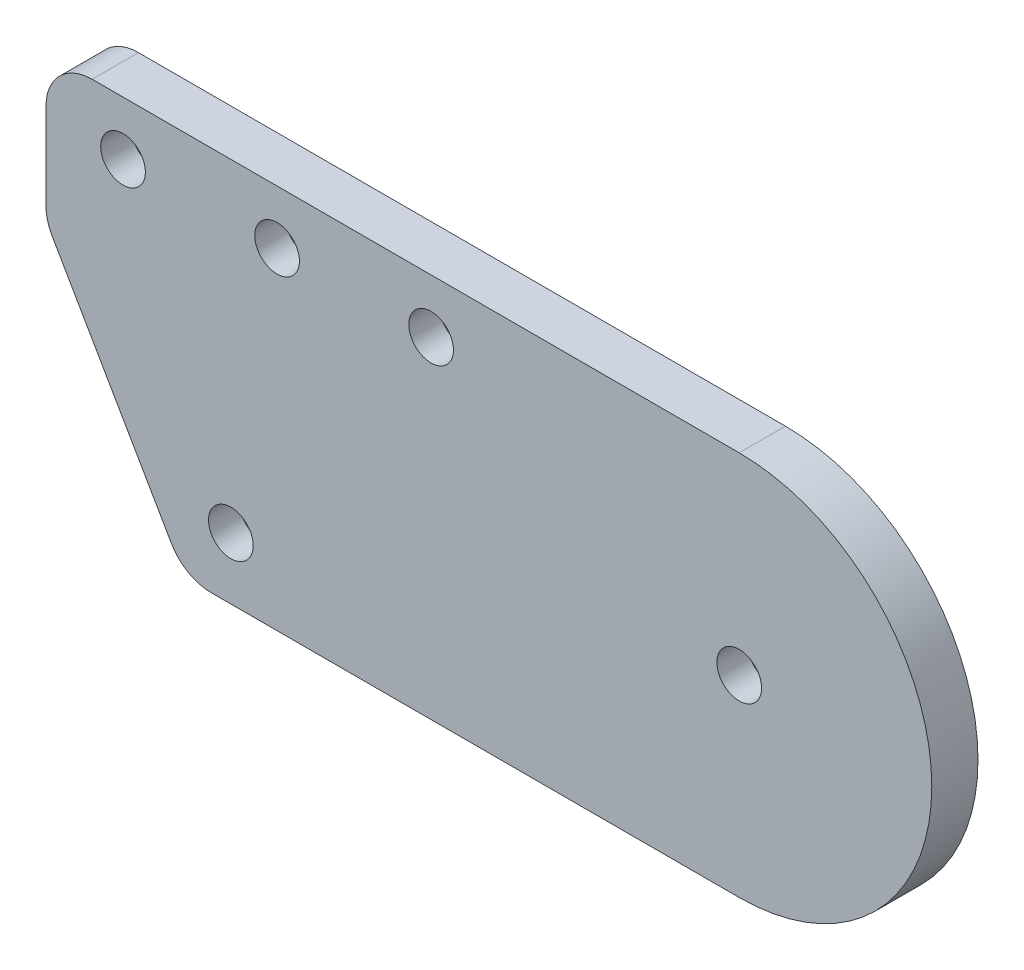
ISO-10303-21;
HEADER;
FILE_DESCRIPTION(('STEP AP214'),'2;1');
FILE_NAME('part.step','',(''),(''),'','','');
FILE_SCHEMA(('AUTOMOTIVE_DESIGN { 1 0 10303 214 1 1 1 1 }'));
ENDSEC;
DATA;
#1=APPLICATION_CONTEXT('core data for automotive mechanical design processes');
#2=APPLICATION_PROTOCOL_DEFINITION('international standard','automotive_design',2000,#1);
#3=PRODUCT_CONTEXT('',#1,'mechanical');
#4=PRODUCT('Part','Part','',(#3));
#5=PRODUCT_RELATED_PRODUCT_CATEGORY('part','',(#4));
#6=PRODUCT_DEFINITION_FORMATION('','',#4);
#7=PRODUCT_DEFINITION_CONTEXT('part definition',#1,'design');
#8=PRODUCT_DEFINITION('design','',#6,#7);
#9=PRODUCT_DEFINITION_SHAPE('','',#8);
#10=(LENGTH_UNIT() NAMED_UNIT(*) SI_UNIT(.MILLI.,.METRE.));
#11=(NAMED_UNIT(*) PLANE_ANGLE_UNIT() SI_UNIT($,.RADIAN.));
#12=(NAMED_UNIT(*) SI_UNIT($,.STERADIAN.) SOLID_ANGLE_UNIT());
#13=UNCERTAINTY_MEASURE_WITH_UNIT(LENGTH_MEASURE(1.E-05),#10,'distance_accuracy_value','');
#14=(GEOMETRIC_REPRESENTATION_CONTEXT(3) GLOBAL_UNCERTAINTY_ASSIGNED_CONTEXT((#13)) GLOBAL_UNIT_ASSIGNED_CONTEXT((#10,
#11,#12)) REPRESENTATION_CONTEXT('',''));
#15=CARTESIAN_POINT('',(0.,0.,0.));
#16=DIRECTION('',(0.,0.,1.));
#17=DIRECTION('',(1.,0.,0.));
#18=AXIS2_PLACEMENT_3D('',#15,#16,#17);
#19=CARTESIAN_POINT('',(35.,-19.5,3.));
#20=DIRECTION('',(0.,0.,-1.));
#21=DIRECTION('',(-1.,0.,0.));
#22=AXIS2_PLACEMENT_3D('',#19,#20,#21);
#23=CYLINDRICAL_SURFACE('',#22,1.45);
#24=CARTESIAN_POINT('',(35.,-19.5,3.));
#25=DIRECTION('',(0.,0.,1.));
#26=DIRECTION('',(1.,0.,0.));
#27=AXIS2_PLACEMENT_3D('',#24,#25,#26);
#28=CIRCLE('',#27,1.45);
#29=CARTESIAN_POINT('',(36.45,-19.5,3.));
#30=VERTEX_POINT('',#29);
#31=EDGE_CURVE('E236',#30,#30,#28,.T.);
#32=ORIENTED_EDGE('',*,*,#31,.T.);
#33=EDGE_LOOP('',(#32));
#34=FACE_BOUND('',#33,.T.);
#35=CARTESIAN_POINT('',(35.,-19.5,1.));
#36=DIRECTION('',(0.,0.,-1.));
#37=DIRECTION('',(-1.,0.,0.));
#38=AXIS2_PLACEMENT_3D('',#35,#36,#37);
#39=CIRCLE('',#38,1.45);
#40=CARTESIAN_POINT('',(33.55,-19.5,1.));
#41=VERTEX_POINT('',#40);
#42=EDGE_CURVE('E49',#41,#41,#39,.T.);
#43=ORIENTED_EDGE('',*,*,#42,.T.);
#44=EDGE_LOOP('',(#43));
#45=FACE_BOUND('',#44,.T.);
#46=ADVANCED_FACE('F45',(#34,#45),#23,.F.);
#47=CARTESIAN_POINT('',(2.00000000000001,-28.,0.));
#48=DIRECTION('',(0.,0.,1.));
#49=DIRECTION('',(1.,0.,0.));
#50=AXIS2_PLACEMENT_3D('',#47,#48,#49);
#51=CYLINDRICAL_SURFACE('',#50,1.45);
#52=CARTESIAN_POINT('',(2.00000000000001,-28.,3.));
#53=DIRECTION('',(0.,0.,1.));
#54=DIRECTION('',(1.,0.,0.));
#55=AXIS2_PLACEMENT_3D('',#52,#53,#54);
#56=CIRCLE('',#55,1.45);
#57=CARTESIAN_POINT('',(3.45000000000001,-28.,3.));
#58=VERTEX_POINT('',#57);
#59=EDGE_CURVE('E173',#58,#58,#56,.T.);
#60=ORIENTED_EDGE('',*,*,#59,.T.);
#61=EDGE_LOOP('',(#60));
#62=FACE_BOUND('',#61,.T.);
#63=CARTESIAN_POINT('',(2.00000000000001,-28.,1.));
#64=DIRECTION('',(0.,0.,-1.));
#65=DIRECTION('',(-1.,0.,0.));
#66=AXIS2_PLACEMENT_3D('',#63,#64,#65);
#67=CIRCLE('',#66,1.45);
#68=CARTESIAN_POINT('',(0.550000000000008,-28.,1.));
#69=VERTEX_POINT('',#68);
#70=EDGE_CURVE('E135',#69,#69,#67,.F.);
#71=ORIENTED_EDGE('',*,*,#70,.F.);
#72=EDGE_LOOP('',(#71));
#73=FACE_BOUND('',#72,.T.);
#74=ADVANCED_FACE('F268',(#62,#73),#51,.F.);
#75=CARTESIAN_POINT('',(15.,-10.5,3.));
#76=DIRECTION('',(0.,0.,-1.));
#77=DIRECTION('',(-1.,0.,0.));
#78=AXIS2_PLACEMENT_3D('',#75,#76,#77);
#79=CYLINDRICAL_SURFACE('',#78,1.45);
#80=CARTESIAN_POINT('',(15.,-10.5,3.));
#81=DIRECTION('',(0.,0.,1.));
#82=DIRECTION('',(1.,0.,0.));
#83=AXIS2_PLACEMENT_3D('',#80,#81,#82);
#84=CIRCLE('',#83,1.45);
#85=CARTESIAN_POINT('',(16.45,-10.5,3.));
#86=VERTEX_POINT('',#85);
#87=EDGE_CURVE('E232',#86,#86,#84,.T.);
#88=ORIENTED_EDGE('',*,*,#87,.T.);
#89=EDGE_LOOP('',(#88));
#90=FACE_BOUND('',#89,.T.);
#91=CARTESIAN_POINT('',(15.,-10.5,1.));
#92=DIRECTION('',(0.,0.,-1.));
#93=DIRECTION('',(-1.,0.,0.));
#94=AXIS2_PLACEMENT_3D('',#91,#92,#93);
#95=CIRCLE('',#94,1.45);
#96=CARTESIAN_POINT('',(13.55,-10.5,1.));
#97=VERTEX_POINT('',#96);
#98=EDGE_CURVE('E169',#97,#97,#95,.T.);
#99=ORIENTED_EDGE('',*,*,#98,.T.);
#100=EDGE_LOOP('',(#99));
#101=FACE_BOUND('',#100,.T.);
#102=ADVANCED_FACE('F275',(#90,#101),#79,.F.);
#103=CARTESIAN_POINT('',(5.,-10.5,3.));
#104=DIRECTION('',(0.,0.,-1.));
#105=DIRECTION('',(-1.,0.,0.));
#106=AXIS2_PLACEMENT_3D('',#103,#104,#105);
#107=CYLINDRICAL_SURFACE('',#106,1.45);
#108=CARTESIAN_POINT('',(5.,-10.5,3.));
#109=DIRECTION('',(0.,0.,1.));
#110=DIRECTION('',(1.,0.,0.));
#111=AXIS2_PLACEMENT_3D('',#108,#109,#110);
#112=CIRCLE('',#111,1.45);
#113=CARTESIAN_POINT('',(6.45,-10.5,3.));
#114=VERTEX_POINT('',#113);
#115=EDGE_CURVE('E228',#114,#114,#112,.T.);
#116=ORIENTED_EDGE('',*,*,#115,.T.);
#117=EDGE_LOOP('',(#116));
#118=FACE_BOUND('',#117,.T.);
#119=CARTESIAN_POINT('',(5.,-10.5,1.));
#120=DIRECTION('',(0.,0.,-1.));
#121=DIRECTION('',(-1.,0.,0.));
#122=AXIS2_PLACEMENT_3D('',#119,#120,#121);
#123=CIRCLE('',#122,1.45);
#124=CARTESIAN_POINT('',(3.55,-10.5,1.));
#125=VERTEX_POINT('',#124);
#126=EDGE_CURVE('E164',#125,#125,#123,.T.);
#127=ORIENTED_EDGE('',*,*,#126,.T.);
#128=EDGE_LOOP('',(#127));
#129=FACE_BOUND('',#128,.T.);
#130=ADVANCED_FACE('F402',(#118,#129),#107,.F.);
#131=CARTESIAN_POINT('',(-5.,-10.5,3.));
#132=DIRECTION('',(0.,0.,-1.));
#133=DIRECTION('',(-1.,0.,0.));
#134=AXIS2_PLACEMENT_3D('',#131,#132,#133);
#135=CYLINDRICAL_SURFACE('',#134,1.45);
#136=CARTESIAN_POINT('',(-5.,-10.5,3.));
#137=DIRECTION('',(0.,0.,1.));
#138=DIRECTION('',(1.,0.,0.));
#139=AXIS2_PLACEMENT_3D('',#136,#137,#138);
#140=CIRCLE('',#139,1.45);
#141=CARTESIAN_POINT('',(-3.55,-10.5,3.));
#142=VERTEX_POINT('',#141);
#143=EDGE_CURVE('E124',#142,#142,#140,.T.);
#144=ORIENTED_EDGE('',*,*,#143,.T.);
#145=EDGE_LOOP('',(#144));
#146=FACE_BOUND('',#145,.T.);
#147=CARTESIAN_POINT('',(-5.,-10.5,1.));
#148=DIRECTION('',(0.,0.,-1.));
#149=DIRECTION('',(-1.,0.,0.));
#150=AXIS2_PLACEMENT_3D('',#147,#148,#149);
#151=CIRCLE('',#150,1.45);
#152=CARTESIAN_POINT('',(-6.45,-10.5,1.));
#153=VERTEX_POINT('',#152);
#154=EDGE_CURVE('E160',#153,#153,#151,.T.);
#155=ORIENTED_EDGE('',*,*,#154,.T.);
#156=EDGE_LOOP('',(#155));
#157=FACE_BOUND('',#156,.T.);
#158=ADVANCED_FACE('F284',(#146,#157),#135,.F.);
#159=CARTESIAN_POINT('',(35.,-19.5,3.));
#160=DIRECTION('',(0.,0.,-1.));
#161=DIRECTION('',(-1.,0.,0.));
#162=AXIS2_PLACEMENT_3D('',#159,#160,#161);
#163=PLANE('',#162);
#164=DIRECTION('',(-1.,0.,0.));
#165=VECTOR('',#164,1.);
#166=CARTESIAN_POINT('',(-9.99999999999999,-6.99999999999998,3.));
#167=LINE('',#166,#165);
#168=CARTESIAN_POINT('',(35.,-7.,3.));
#169=VERTEX_POINT('',#168);
#170=CARTESIAN_POINT('',(-6.99999999999999,-6.99999999999999,3.));
#171=VERTEX_POINT('',#170);
#172=EDGE_CURVE('E144',#169,#171,#167,.T.);
#173=ORIENTED_EDGE('',*,*,#172,.T.);
#174=CARTESIAN_POINT('',(-6.99999999999999,-9.99999999999998,3.));
#175=DIRECTION('',(0.,0.,-1.));
#176=DIRECTION('',(-1.,0.,0.));
#177=AXIS2_PLACEMENT_3D('',#174,#175,#176);
#178=CIRCLE('',#177,3.);
#179=CARTESIAN_POINT('',(-9.99999999999999,-9.99999999999998,3.));
#180=VERTEX_POINT('',#179);
#181=EDGE_CURVE('E200',#171,#180,#178,.F.);
#182=ORIENTED_EDGE('',*,*,#181,.T.);
#183=DIRECTION('',(0.,-1.,0.));
#184=VECTOR('',#183,1.);
#185=CARTESIAN_POINT('',(-9.99999999999999,-6.99999999999998,3.));
#186=LINE('',#185,#184);
#187=CARTESIAN_POINT('',(-9.99999999999999,-15.6197140366764,3.));
#188=VERTEX_POINT('',#187);
#189=EDGE_CURVE('E150',#180,#188,#186,.T.);
#190=ORIENTED_EDGE('',*,*,#189,.T.);
#191=CARTESIAN_POINT('',(-6.99999999999999,-15.6197140366764,3.));
#192=DIRECTION('',(0.,0.,-1.));
#193=DIRECTION('',(-1.,0.,0.));
#194=AXIS2_PLACEMENT_3D('',#191,#192,#193);
#195=CIRCLE('',#194,3.);
#196=CARTESIAN_POINT('',(-9.59807621135331,-17.1197140366764,3.));
#197=VERTEX_POINT('',#196);
#198=EDGE_CURVE('E70',#188,#197,#195,.F.);
#199=ORIENTED_EDGE('',*,*,#198,.T.);
#200=DIRECTION('',(0.499999999999997,-0.86602540378444,0.));
#201=VECTOR('',#200,1.);
#202=CARTESIAN_POINT('',(-9.99999999999999,-16.4235616139697,3.));
#203=LINE('',#202,#201);
#204=CARTESIAN_POINT('',(-1.8729645085943,-30.5,3.));
#205=VERTEX_POINT('',#204);
#206=EDGE_CURVE('E213',#197,#205,#203,.T.);
#207=ORIENTED_EDGE('',*,*,#206,.T.);
#208=CARTESIAN_POINT('',(0.725111702759017,-29.,3.));
#209=DIRECTION('',(0.,0.,-1.));
#210=DIRECTION('',(-1.,0.,0.));
#211=AXIS2_PLACEMENT_3D('',#208,#209,#210);
#212=CIRCLE('',#211,3.);
#213=CARTESIAN_POINT('',(0.725111702759017,-32.,3.));
#214=VERTEX_POINT('',#213);
#215=EDGE_CURVE('E62',#205,#214,#212,.F.);
#216=ORIENTED_EDGE('',*,*,#215,.T.);
#217=DIRECTION('',(1.,0.,0.));
#218=VECTOR('',#217,1.);
#219=CARTESIAN_POINT('',(-1.00693910480987,-32.,3.));
#220=LINE('',#219,#218);
#221=CARTESIAN_POINT('',(35.0000000000001,-32.,3.));
#222=VERTEX_POINT('',#221);
#223=EDGE_CURVE('E216',#214,#222,#220,.T.);
#224=ORIENTED_EDGE('',*,*,#223,.T.);
#225=CARTESIAN_POINT('',(35.,-19.5,3.));
#226=DIRECTION('',(0.,0.,1.));
#227=DIRECTION('',(-1.,0.,0.));
#228=AXIS2_PLACEMENT_3D('',#225,#226,#227);
#229=CIRCLE('',#228,12.5);
#230=EDGE_CURVE('E132',#222,#169,#229,.T.);
#231=ORIENTED_EDGE('',*,*,#230,.T.);
#232=EDGE_LOOP('',(#173,#182,#190,#199,#207,#216,#224,#231));
#233=FACE_BOUND('',#232,.T.);
#234=ORIENTED_EDGE('',*,*,#31,.F.);
#235=EDGE_LOOP('',(#234));
#236=FACE_BOUND('',#235,.T.);
#237=ORIENTED_EDGE('',*,*,#87,.F.);
#238=EDGE_LOOP('',(#237));
#239=FACE_BOUND('',#238,.T.);
#240=ORIENTED_EDGE('',*,*,#115,.F.);
#241=EDGE_LOOP('',(#240));
#242=FACE_BOUND('',#241,.T.);
#243=ORIENTED_EDGE('',*,*,#143,.F.);
#244=EDGE_LOOP('',(#243));
#245=FACE_BOUND('',#244,.T.);
#246=ORIENTED_EDGE('',*,*,#59,.F.);
#247=EDGE_LOOP('',(#246));
#248=FACE_BOUND('',#247,.T.);
#249=ADVANCED_FACE('F253',(#233,#236,#239,#242,#245,#248),#163,.F.);
#250=CARTESIAN_POINT('',(35.,-19.5,0.));
#251=DIRECTION('',(0.,0.,-1.));
#252=DIRECTION('',(-1.,0.,0.));
#253=AXIS2_PLACEMENT_3D('',#250,#251,#252);
#254=PLANE('',#253);
#255=CARTESIAN_POINT('',(35.,-19.5,0.));
#256=DIRECTION('',(0.,0.,-1.));
#257=DIRECTION('',(-1.,0.,0.));
#258=AXIS2_PLACEMENT_3D('',#255,#256,#257);
#259=CIRCLE('',#258,3.05);
#260=CARTESIAN_POINT('',(31.95,-19.5,0.));
#261=VERTEX_POINT('',#260);
#262=EDGE_CURVE('E449',#261,#261,#259,.T.);
#263=ORIENTED_EDGE('',*,*,#262,.F.);
#264=EDGE_LOOP('',(#263));
#265=FACE_BOUND('',#264,.T.);
#266=CARTESIAN_POINT('',(2.00000000000001,-28.,0.));
#267=DIRECTION('',(0.,0.,-1.));
#268=DIRECTION('',(-1.,0.,0.));
#269=AXIS2_PLACEMENT_3D('',#266,#267,#268);
#270=CIRCLE('',#269,3.05);
#271=CARTESIAN_POINT('',(-1.04999999999999,-28.,0.));
#272=VERTEX_POINT('',#271);
#273=EDGE_CURVE('E439',#272,#272,#270,.T.);
#274=ORIENTED_EDGE('',*,*,#273,.F.);
#275=EDGE_LOOP('',(#274));
#276=FACE_BOUND('',#275,.T.);
#277=DIRECTION('',(0.,-1.,0.));
#278=VECTOR('',#277,1.);
#279=CARTESIAN_POINT('',(-9.99999999999999,-6.99999999999998,0.));
#280=LINE('',#279,#278);
#281=CARTESIAN_POINT('',(-9.99999999999999,-9.99999999999998,0.));
#282=VERTEX_POINT('',#281);
#283=CARTESIAN_POINT('',(-9.99999999999999,-15.6197140366764,0.));
#284=VERTEX_POINT('',#283);
#285=EDGE_CURVE('E145',#282,#284,#280,.T.);
#286=ORIENTED_EDGE('',*,*,#285,.F.);
#287=CARTESIAN_POINT('',(-6.99999999999999,-9.99999999999998,0.));
#288=DIRECTION('',(0.,0.,-1.));
#289=DIRECTION('',(-1.,0.,0.));
#290=AXIS2_PLACEMENT_3D('',#287,#288,#289);
#291=CIRCLE('',#290,3.);
#292=CARTESIAN_POINT('',(-6.99999999999999,-6.99999999999999,0.));
#293=VERTEX_POINT('',#292);
#294=EDGE_CURVE('E190',#282,#293,#291,.T.);
#295=ORIENTED_EDGE('',*,*,#294,.T.);
#296=DIRECTION('',(-1.,0.,0.));
#297=VECTOR('',#296,1.);
#298=CARTESIAN_POINT('',(-9.99999999999999,-6.99999999999998,0.));
#299=LINE('',#298,#297);
#300=CARTESIAN_POINT('',(35.,-7.,0.));
#301=VERTEX_POINT('',#300);
#302=EDGE_CURVE('E142',#301,#293,#299,.T.);
#303=ORIENTED_EDGE('',*,*,#302,.F.);
#304=CARTESIAN_POINT('',(35.,-19.5,0.));
#305=DIRECTION('',(0.,0.,1.));
#306=DIRECTION('',(-1.,0.,0.));
#307=AXIS2_PLACEMENT_3D('',#304,#305,#306);
#308=CIRCLE('',#307,12.5);
#309=CARTESIAN_POINT('',(35.0000000000001,-32.,0.));
#310=VERTEX_POINT('',#309);
#311=EDGE_CURVE('E130',#310,#301,#308,.T.);
#312=ORIENTED_EDGE('',*,*,#311,.F.);
#313=DIRECTION('',(1.,0.,0.));
#314=VECTOR('',#313,1.);
#315=CARTESIAN_POINT('',(-1.00693910480987,-32.,0.));
#316=LINE('',#315,#314);
#317=CARTESIAN_POINT('',(0.725111702759017,-32.,0.));
#318=VERTEX_POINT('',#317);
#319=EDGE_CURVE('E114',#318,#310,#316,.T.);
#320=ORIENTED_EDGE('',*,*,#319,.F.);
#321=CARTESIAN_POINT('',(0.725111702759017,-29.,0.));
#322=DIRECTION('',(0.,0.,-1.));
#323=DIRECTION('',(-1.,0.,0.));
#324=AXIS2_PLACEMENT_3D('',#321,#322,#323);
#325=CIRCLE('',#324,3.);
#326=CARTESIAN_POINT('',(-1.8729645085943,-30.5,0.));
#327=VERTEX_POINT('',#326);
#328=EDGE_CURVE('E184',#318,#327,#325,.T.);
#329=ORIENTED_EDGE('',*,*,#328,.T.);
#330=DIRECTION('',(0.499999999999997,-0.86602540378444,0.));
#331=VECTOR('',#330,1.);
#332=CARTESIAN_POINT('',(-9.99999999999999,-16.4235616139697,0.));
#333=LINE('',#332,#331);
#334=CARTESIAN_POINT('',(-9.59807621135331,-17.1197140366764,0.));
#335=VERTEX_POINT('',#334);
#336=EDGE_CURVE('E125',#335,#327,#333,.T.);
#337=ORIENTED_EDGE('',*,*,#336,.F.);
#338=CARTESIAN_POINT('',(-6.99999999999999,-15.6197140366764,0.));
#339=DIRECTION('',(0.,0.,-1.));
#340=DIRECTION('',(-1.,0.,0.));
#341=AXIS2_PLACEMENT_3D('',#338,#339,#340);
#342=CIRCLE('',#341,3.);
#343=EDGE_CURVE('E187',#335,#284,#342,.T.);
#344=ORIENTED_EDGE('',*,*,#343,.T.);
#345=EDGE_LOOP('',(#286,#295,#303,#312,#320,#329,#337,#344));
#346=FACE_BOUND('',#345,.T.);
#347=CARTESIAN_POINT('',(15.,-10.5,0.));
#348=DIRECTION('',(0.,0.,-1.));
#349=DIRECTION('',(-1.,0.,0.));
#350=AXIS2_PLACEMENT_3D('',#347,#348,#349);
#351=CIRCLE('',#350,3.);
#352=CARTESIAN_POINT('',(12.,-10.5,0.));
#353=VERTEX_POINT('',#352);
#354=EDGE_CURVE('E424',#353,#353,#351,.T.);
#355=ORIENTED_EDGE('',*,*,#354,.F.);
#356=EDGE_LOOP('',(#355));
#357=FACE_BOUND('',#356,.T.);
#358=CARTESIAN_POINT('',(5.,-10.5,0.));
#359=DIRECTION('',(0.,0.,-1.));
#360=DIRECTION('',(-1.,0.,0.));
#361=AXIS2_PLACEMENT_3D('',#358,#359,#360);
#362=CIRCLE('',#361,3.);
#363=CARTESIAN_POINT('',(2.,-10.5,0.));
#364=VERTEX_POINT('',#363);
#365=EDGE_CURVE('E418',#364,#364,#362,.T.);
#366=ORIENTED_EDGE('',*,*,#365,.F.);
#367=EDGE_LOOP('',(#366));
#368=FACE_BOUND('',#367,.T.);
#369=CARTESIAN_POINT('',(-5.,-10.5,0.));
#370=DIRECTION('',(0.,0.,-1.));
#371=DIRECTION('',(-1.,0.,0.));
#372=AXIS2_PLACEMENT_3D('',#369,#370,#371);
#373=CIRCLE('',#372,3.);
#374=CARTESIAN_POINT('',(-8.,-10.5,0.));
#375=VERTEX_POINT('',#374);
#376=EDGE_CURVE('E419',#375,#375,#373,.T.);
#377=ORIENTED_EDGE('',*,*,#376,.F.);
#378=EDGE_LOOP('',(#377));
#379=FACE_BOUND('',#378,.T.);
#380=ADVANCED_FACE('F139',(#265,#276,#346,#357,#368,#379),#254,.T.);
#381=CARTESIAN_POINT('',(-9.99999999999999,-6.99999999999998,3.));
#382=DIRECTION('',(0.,-1.,0.));
#383=DIRECTION('',(1.,0.,0.));
#384=AXIS2_PLACEMENT_3D('',#381,#382,#383);
#385=PLANE('',#384);
#386=ORIENTED_EDGE('',*,*,#302,.T.);
#387=DIRECTION('',(0.,0.,-1.));
#388=VECTOR('',#387,1.);
#389=CARTESIAN_POINT('',(-6.99999999999999,-6.99999999999999,3.));
#390=LINE('',#389,#388);
#391=EDGE_CURVE('E193',#293,#171,#390,.F.);
#392=ORIENTED_EDGE('',*,*,#391,.T.);
#393=ORIENTED_EDGE('',*,*,#172,.F.);
#394=DIRECTION('',(0.,0.,-1.));
#395=VECTOR('',#394,1.);
#396=CARTESIAN_POINT('',(35.,-7.,3.));
#397=LINE('',#396,#395);
#398=EDGE_CURVE('E156',#169,#301,#397,.T.);
#399=ORIENTED_EDGE('',*,*,#398,.T.);
#400=EDGE_LOOP('',(#386,#392,#393,#399));
#401=FACE_BOUND('',#400,.T.);
#402=ADVANCED_FACE('F246',(#401),#385,.F.);
#403=CARTESIAN_POINT('',(-9.99999999999999,-6.99999999999998,3.));
#404=DIRECTION('',(1.,0.,0.));
#405=DIRECTION('',(0.,1.,0.));
#406=AXIS2_PLACEMENT_3D('',#403,#404,#405);
#407=PLANE('',#406);
#408=ORIENTED_EDGE('',*,*,#189,.F.);
#409=DIRECTION('',(0.,0.,-1.));
#410=VECTOR('',#409,1.);
#411=CARTESIAN_POINT('',(-9.99999999999999,-9.99999999999998,3.));
#412=LINE('',#411,#410);
#413=EDGE_CURVE('E180',#180,#282,#412,.T.);
#414=ORIENTED_EDGE('',*,*,#413,.T.);
#415=ORIENTED_EDGE('',*,*,#285,.T.);
#416=DIRECTION('',(0.,0.,-1.));
#417=VECTOR('',#416,1.);
#418=CARTESIAN_POINT('',(-9.99999999999999,-15.6197140366764,3.));
#419=LINE('',#418,#417);
#420=EDGE_CURVE('E159',#284,#188,#419,.F.);
#421=ORIENTED_EDGE('',*,*,#420,.T.);
#422=EDGE_LOOP('',(#408,#414,#415,#421));
#423=FACE_BOUND('',#422,.T.);
#424=ADVANCED_FACE('F256',(#423),#407,.F.);
#425=CARTESIAN_POINT('',(35.,-19.5,3.));
#426=DIRECTION('',(0.,0.,-1.));
#427=DIRECTION('',(-1.,0.,0.));
#428=AXIS2_PLACEMENT_3D('',#425,#426,#427);
#429=CYLINDRICAL_SURFACE('',#428,12.5);
#430=ORIENTED_EDGE('',*,*,#230,.F.);
#431=DIRECTION('',(0.,0.,1.));
#432=VECTOR('',#431,1.);
#433=CARTESIAN_POINT('',(35.0000000000001,-32.,0.));
#434=LINE('',#433,#432);
#435=EDGE_CURVE('E118',#310,#222,#434,.T.);
#436=ORIENTED_EDGE('',*,*,#435,.F.);
#437=ORIENTED_EDGE('',*,*,#311,.T.);
#438=ORIENTED_EDGE('',*,*,#398,.F.);
#439=EDGE_LOOP('',(#430,#436,#437,#438));
#440=FACE_BOUND('',#439,.T.);
#441=ADVANCED_FACE('F128',(#440),#429,.T.);
#442=CARTESIAN_POINT('',(-9.99999999999999,-16.4235616139697,0.));
#443=DIRECTION('',(-0.86602540378444,-0.499999999999997,0.));
#444=DIRECTION('',(0.499999999999997,-0.86602540378444,0.));
#445=AXIS2_PLACEMENT_3D('',#442,#443,#444);
#446=PLANE('',#445);
#447=ORIENTED_EDGE('',*,*,#206,.F.);
#448=DIRECTION('',(0.,0.,-1.));
#449=VECTOR('',#448,1.);
#450=CARTESIAN_POINT('',(-9.59807621135331,-17.1197140366764,0.));
#451=LINE('',#450,#449);
#452=EDGE_CURVE('E55',#197,#335,#451,.T.);
#453=ORIENTED_EDGE('',*,*,#452,.T.);
#454=ORIENTED_EDGE('',*,*,#336,.T.);
#455=DIRECTION('',(0.,0.,1.));
#456=VECTOR('',#455,1.);
#457=CARTESIAN_POINT('',(-1.8729645085943,-30.5,0.));
#458=LINE('',#457,#456);
#459=EDGE_CURVE('E203',#327,#205,#458,.T.);
#460=ORIENTED_EDGE('',*,*,#459,.T.);
#461=EDGE_LOOP('',(#447,#453,#454,#460));
#462=FACE_BOUND('',#461,.T.);
#463=ADVANCED_FACE('F212',(#462),#446,.T.);
#464=CARTESIAN_POINT('',(-1.00693910480987,-32.,0.));
#465=DIRECTION('',(0.,-1.,0.));
#466=DIRECTION('',(1.,0.,0.));
#467=AXIS2_PLACEMENT_3D('',#464,#465,#466);
#468=PLANE('',#467);
#469=ORIENTED_EDGE('',*,*,#223,.F.);
#470=DIRECTION('',(0.,0.,1.));
#471=VECTOR('',#470,1.);
#472=CARTESIAN_POINT('',(0.725111702759017,-32.,0.));
#473=LINE('',#472,#471);
#474=EDGE_CURVE('E11',#214,#318,#473,.F.);
#475=ORIENTED_EDGE('',*,*,#474,.T.);
#476=ORIENTED_EDGE('',*,*,#319,.T.);
#477=ORIENTED_EDGE('',*,*,#435,.T.);
#478=EDGE_LOOP('',(#469,#475,#476,#477));
#479=FACE_BOUND('',#478,.T.);
#480=ADVANCED_FACE('F117',(#479),#468,.T.);
#481=CARTESIAN_POINT('',(-5.,-10.5,1.));
#482=DIRECTION('',(0.,0.,-1.));
#483=DIRECTION('',(-1.,0.,0.));
#484=AXIS2_PLACEMENT_3D('',#481,#482,#483);
#485=CYLINDRICAL_SURFACE('',#484,3.);
#486=CARTESIAN_POINT('',(-5.,-10.5,1.));
#487=DIRECTION('',(0.,0.,-1.));
#488=DIRECTION('',(-1.,0.,0.));
#489=AXIS2_PLACEMENT_3D('',#486,#487,#488);
#490=CIRCLE('',#489,3.);
#491=CARTESIAN_POINT('',(-8.,-10.5,1.));
#492=VERTEX_POINT('',#491);
#493=EDGE_CURVE('E134',#492,#492,#490,.T.);
#494=ORIENTED_EDGE('',*,*,#493,.F.);
#495=EDGE_LOOP('',(#494));
#496=FACE_BOUND('',#495,.T.);
#497=ORIENTED_EDGE('',*,*,#376,.T.);
#498=EDGE_LOOP('',(#497));
#499=FACE_BOUND('',#498,.T.);
#500=ADVANCED_FACE('F319',(#496,#499),#485,.F.);
#501=CARTESIAN_POINT('',(-5.,-10.5,1.));
#502=DIRECTION('',(0.,0.,-1.));
#503=DIRECTION('',(-1.,0.,0.));
#504=AXIS2_PLACEMENT_3D('',#501,#502,#503);
#505=PLANE('',#504);
#506=ORIENTED_EDGE('',*,*,#154,.F.);
#507=EDGE_LOOP('',(#506));
#508=FACE_BOUND('',#507,.T.);
#509=ORIENTED_EDGE('',*,*,#493,.T.);
#510=EDGE_LOOP('',(#509));
#511=FACE_BOUND('',#510,.T.);
#512=ADVANCED_FACE('F390',(#508,#511),#505,.T.);
#513=CARTESIAN_POINT('',(5.,-10.5,1.));
#514=DIRECTION('',(0.,0.,-1.));
#515=DIRECTION('',(-1.,0.,0.));
#516=AXIS2_PLACEMENT_3D('',#513,#514,#515);
#517=CYLINDRICAL_SURFACE('',#516,3.);
#518=CARTESIAN_POINT('',(5.,-10.5,1.));
#519=DIRECTION('',(0.,0.,-1.));
#520=DIRECTION('',(-1.,0.,0.));
#521=AXIS2_PLACEMENT_3D('',#518,#519,#520);
#522=CIRCLE('',#521,3.);
#523=CARTESIAN_POINT('',(2.,-10.5,1.));
#524=VERTEX_POINT('',#523);
#525=EDGE_CURVE('E416',#524,#524,#522,.T.);
#526=ORIENTED_EDGE('',*,*,#525,.F.);
#527=EDGE_LOOP('',(#526));
#528=FACE_BOUND('',#527,.T.);
#529=ORIENTED_EDGE('',*,*,#365,.T.);
#530=EDGE_LOOP('',(#529));
#531=FACE_BOUND('',#530,.T.);
#532=ADVANCED_FACE('F387',(#528,#531),#517,.F.);
#533=CARTESIAN_POINT('',(5.,-10.5,1.));
#534=DIRECTION('',(0.,0.,-1.));
#535=DIRECTION('',(-1.,0.,0.));
#536=AXIS2_PLACEMENT_3D('',#533,#534,#535);
#537=PLANE('',#536);
#538=ORIENTED_EDGE('',*,*,#126,.F.);
#539=EDGE_LOOP('',(#538));
#540=FACE_BOUND('',#539,.T.);
#541=ORIENTED_EDGE('',*,*,#525,.T.);
#542=EDGE_LOOP('',(#541));
#543=FACE_BOUND('',#542,.T.);
#544=ADVANCED_FACE('F385',(#540,#543),#537,.T.);
#545=CARTESIAN_POINT('',(15.,-10.5,1.));
#546=DIRECTION('',(0.,0.,-1.));
#547=DIRECTION('',(-1.,0.,0.));
#548=AXIS2_PLACEMENT_3D('',#545,#546,#547);
#549=CYLINDRICAL_SURFACE('',#548,3.);
#550=CARTESIAN_POINT('',(15.,-10.5,1.));
#551=DIRECTION('',(0.,0.,-1.));
#552=DIRECTION('',(-1.,0.,0.));
#553=AXIS2_PLACEMENT_3D('',#550,#551,#552);
#554=CIRCLE('',#553,3.);
#555=CARTESIAN_POINT('',(12.,-10.5,1.));
#556=VERTEX_POINT('',#555);
#557=EDGE_CURVE('E165',#556,#556,#554,.T.);
#558=ORIENTED_EDGE('',*,*,#557,.F.);
#559=EDGE_LOOP('',(#558));
#560=FACE_BOUND('',#559,.T.);
#561=ORIENTED_EDGE('',*,*,#354,.T.);
#562=EDGE_LOOP('',(#561));
#563=FACE_BOUND('',#562,.T.);
#564=ADVANCED_FACE('F381',(#560,#563),#549,.F.);
#565=CARTESIAN_POINT('',(15.,-10.5,1.));
#566=DIRECTION('',(0.,0.,-1.));
#567=DIRECTION('',(-1.,0.,0.));
#568=AXIS2_PLACEMENT_3D('',#565,#566,#567);
#569=PLANE('',#568);
#570=ORIENTED_EDGE('',*,*,#98,.F.);
#571=EDGE_LOOP('',(#570));
#572=FACE_BOUND('',#571,.T.);
#573=ORIENTED_EDGE('',*,*,#557,.T.);
#574=EDGE_LOOP('',(#573));
#575=FACE_BOUND('',#574,.T.);
#576=ADVANCED_FACE('F375',(#572,#575),#569,.T.);
#577=CARTESIAN_POINT('',(2.00000000000001,-28.,1.));
#578=DIRECTION('',(0.,0.,-1.));
#579=DIRECTION('',(-1.,0.,0.));
#580=AXIS2_PLACEMENT_3D('',#577,#578,#579);
#581=PLANE('',#580);
#582=CARTESIAN_POINT('',(2.00000000000001,-28.,1.));
#583=DIRECTION('',(0.,0.,-1.));
#584=DIRECTION('',(-1.,0.,0.));
#585=AXIS2_PLACEMENT_3D('',#582,#583,#584);
#586=CIRCLE('',#585,3.05);
#587=CARTESIAN_POINT('',(-1.04999999999999,-28.,1.));
#588=VERTEX_POINT('',#587);
#589=EDGE_CURVE('E177',#588,#588,#586,.T.);
#590=ORIENTED_EDGE('',*,*,#589,.T.);
#591=EDGE_LOOP('',(#590));
#592=FACE_BOUND('',#591,.T.);
#593=ORIENTED_EDGE('',*,*,#70,.T.);
#594=EDGE_LOOP('',(#593));
#595=FACE_BOUND('',#594,.T.);
#596=ADVANCED_FACE('F372',(#592,#595),#581,.T.);
#597=CARTESIAN_POINT('',(2.00000000000001,-28.,1.));
#598=DIRECTION('',(0.,0.,-1.));
#599=DIRECTION('',(-1.,0.,0.));
#600=AXIS2_PLACEMENT_3D('',#597,#598,#599);
#601=CYLINDRICAL_SURFACE('',#600,3.05);
#602=ORIENTED_EDGE('',*,*,#589,.F.);
#603=EDGE_LOOP('',(#602));
#604=FACE_BOUND('',#603,.T.);
#605=ORIENTED_EDGE('',*,*,#273,.T.);
#606=EDGE_LOOP('',(#605));
#607=FACE_BOUND('',#606,.T.);
#608=ADVANCED_FACE('F265',(#604,#607),#601,.F.);
#609=CARTESIAN_POINT('',(-6.99999999999999,-9.99999999999998,3.));
#610=DIRECTION('',(0.,0.,-1.));
#611=DIRECTION('',(-1.,0.,0.));
#612=AXIS2_PLACEMENT_3D('',#609,#610,#611);
#613=CYLINDRICAL_SURFACE('',#612,3.);
#614=ORIENTED_EDGE('',*,*,#181,.F.);
#615=ORIENTED_EDGE('',*,*,#391,.F.);
#616=ORIENTED_EDGE('',*,*,#294,.F.);
#617=ORIENTED_EDGE('',*,*,#413,.F.);
#618=EDGE_LOOP('',(#614,#615,#616,#617));
#619=FACE_BOUND('',#618,.T.);
#620=ADVANCED_FACE('F250',(#619),#613,.T.);
#621=CARTESIAN_POINT('',(-6.99999999999999,-15.6197140366764,0.));
#622=DIRECTION('',(0.,0.,1.));
#623=DIRECTION('',(1.,0.,0.));
#624=AXIS2_PLACEMENT_3D('',#621,#622,#623);
#625=CYLINDRICAL_SURFACE('',#624,3.);
#626=ORIENTED_EDGE('',*,*,#198,.F.);
#627=ORIENTED_EDGE('',*,*,#420,.F.);
#628=ORIENTED_EDGE('',*,*,#343,.F.);
#629=ORIENTED_EDGE('',*,*,#452,.F.);
#630=EDGE_LOOP('',(#626,#627,#628,#629));
#631=FACE_BOUND('',#630,.T.);
#632=ADVANCED_FACE('F258',(#631),#625,.T.);
#633=CARTESIAN_POINT('',(0.725111702759017,-29.,0.));
#634=DIRECTION('',(0.,0.,1.));
#635=DIRECTION('',(1.,0.,0.));
#636=AXIS2_PLACEMENT_3D('',#633,#634,#635);
#637=CYLINDRICAL_SURFACE('',#636,3.);
#638=ORIENTED_EDGE('',*,*,#328,.F.);
#639=ORIENTED_EDGE('',*,*,#474,.F.);
#640=ORIENTED_EDGE('',*,*,#215,.F.);
#641=ORIENTED_EDGE('',*,*,#459,.F.);
#642=EDGE_LOOP('',(#638,#639,#640,#641));
#643=FACE_BOUND('',#642,.T.);
#644=ADVANCED_FACE('F47',(#643),#637,.T.);
#645=CARTESIAN_POINT('',(35.,-19.5,1.));
#646=DIRECTION('',(0.,0.,-1.));
#647=DIRECTION('',(-1.,0.,0.));
#648=AXIS2_PLACEMENT_3D('',#645,#646,#647);
#649=CYLINDRICAL_SURFACE('',#648,3.05);
#650=CARTESIAN_POINT('',(35.,-19.5,1.));
#651=DIRECTION('',(0.,0.,-1.));
#652=DIRECTION('',(-1.,0.,0.));
#653=AXIS2_PLACEMENT_3D('',#650,#651,#652);
#654=CIRCLE('',#653,3.05);
#655=CARTESIAN_POINT('',(31.95,-19.5,1.));
#656=VERTEX_POINT('',#655);
#657=EDGE_CURVE('E446',#656,#656,#654,.T.);
#658=ORIENTED_EDGE('',*,*,#657,.F.);
#659=EDGE_LOOP('',(#658));
#660=FACE_BOUND('',#659,.T.);
#661=ORIENTED_EDGE('',*,*,#262,.T.);
#662=EDGE_LOOP('',(#661));
#663=FACE_BOUND('',#662,.T.);
#664=ADVANCED_FACE('F264',(#660,#663),#649,.F.);
#665=CARTESIAN_POINT('',(35.,-19.5,1.));
#666=DIRECTION('',(0.,0.,-1.));
#667=DIRECTION('',(-1.,0.,0.));
#668=AXIS2_PLACEMENT_3D('',#665,#666,#667);
#669=PLANE('',#668);
#670=ORIENTED_EDGE('',*,*,#42,.F.);
#671=EDGE_LOOP('',(#670));
#672=FACE_BOUND('',#671,.T.);
#673=ORIENTED_EDGE('',*,*,#657,.T.);
#674=EDGE_LOOP('',(#673));
#675=FACE_BOUND('',#674,.T.);
#676=ADVANCED_FACE('F356',(#672,#675),#669,.T.);
#677=CLOSED_SHELL('',(#46,#74,#102,#130,#158,#249,#380,#402,#424,#441,#463,#480,#500,#512,#532,
#544,#564,#576,#596,#608,#620,#632,#644,#664,#676));
#678=MANIFOLD_SOLID_BREP('B2',#677);
#679=ADVANCED_BREP_SHAPE_REPRESENTATION('',(#18,#678),#14);
#680=SHAPE_DEFINITION_REPRESENTATION(#9,#679);
ENDSEC;
END-ISO-10303-21;
